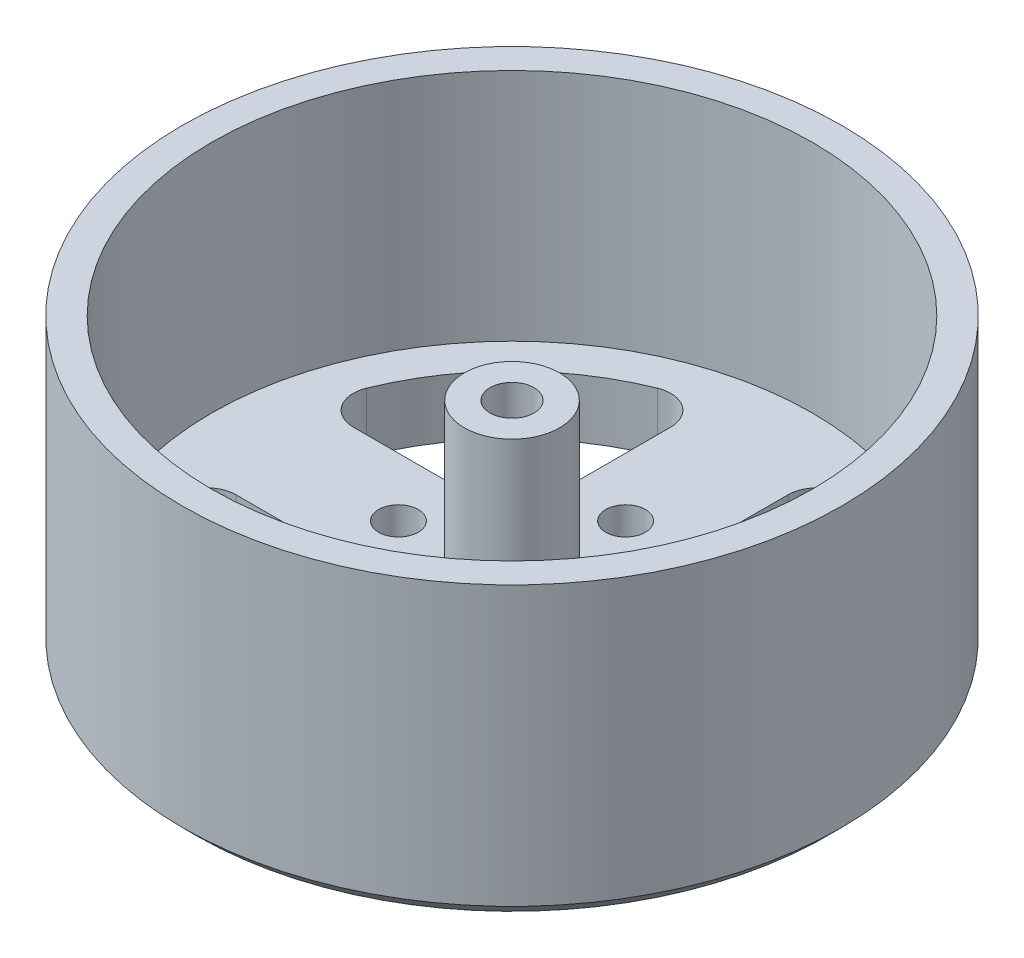
ISO-10303-21;
HEADER;
FILE_DESCRIPTION(('STEP AP214'),'2;1');
FILE_NAME('part.step','',(''),(''),'','','');
FILE_SCHEMA(('AUTOMOTIVE_DESIGN { 1 0 10303 214 1 1 1 1 }'));
ENDSEC;
DATA;
#1=APPLICATION_CONTEXT('core data for automotive mechanical design processes');
#2=APPLICATION_PROTOCOL_DEFINITION('international standard','automotive_design',2000,#1);
#3=PRODUCT_CONTEXT('',#1,'mechanical');
#4=PRODUCT('Part','Part','',(#3));
#5=PRODUCT_RELATED_PRODUCT_CATEGORY('part','',(#4));
#6=PRODUCT_DEFINITION_FORMATION('','',#4);
#7=PRODUCT_DEFINITION_CONTEXT('part definition',#1,'design');
#8=PRODUCT_DEFINITION('design','',#6,#7);
#9=PRODUCT_DEFINITION_SHAPE('','',#8);
#10=(LENGTH_UNIT() NAMED_UNIT(*) SI_UNIT(.MILLI.,.METRE.));
#11=(NAMED_UNIT(*) PLANE_ANGLE_UNIT() SI_UNIT($,.RADIAN.));
#12=(NAMED_UNIT(*) SI_UNIT($,.STERADIAN.) SOLID_ANGLE_UNIT());
#13=UNCERTAINTY_MEASURE_WITH_UNIT(LENGTH_MEASURE(1.E-05),#10,'distance_accuracy_value','');
#14=(GEOMETRIC_REPRESENTATION_CONTEXT(3) GLOBAL_UNCERTAINTY_ASSIGNED_CONTEXT((#13)) GLOBAL_UNIT_ASSIGNED_CONTEXT((#10,
#11,#12)) REPRESENTATION_CONTEXT('',''));
#15=CARTESIAN_POINT('',(0.,0.,0.));
#16=DIRECTION('',(0.,0.,1.));
#17=DIRECTION('',(1.,0.,0.));
#18=AXIS2_PLACEMENT_3D('',#15,#16,#17);
#19=CARTESIAN_POINT('',(0.,4.,0.));
#20=DIRECTION('',(0.,-1.,0.));
#21=DIRECTION('',(0.,0.,-1.));
#22=AXIS2_PLACEMENT_3D('',#19,#20,#21);
#23=CYLINDRICAL_SURFACE('',#22,18.);
#24=CARTESIAN_POINT('',(0.,0.,0.));
#25=DIRECTION('',(0.,1.,0.));
#26=DIRECTION('',(0.,0.,1.));
#27=AXIS2_PLACEMENT_3D('',#24,#25,#26);
#28=CIRCLE('',#27,18.);
#29=CARTESIAN_POINT('',(-6.75,0.,-16.6864465959652));
#30=VERTEX_POINT('',#29);
#31=CARTESIAN_POINT('',(-16.6864465959652,0.,-6.75));
#32=VERTEX_POINT('',#31);
#33=EDGE_CURVE('E494',#30,#32,#28,.T.);
#34=ORIENTED_EDGE('',*,*,#33,.F.);
#35=DIRECTION('',(0.,-1.,0.));
#36=VECTOR('',#35,1.);
#37=CARTESIAN_POINT('',(-6.75,4.,-16.6864465959652));
#38=LINE('',#37,#36);
#39=CARTESIAN_POINT('',(-6.75,4.,-16.6864465959652));
#40=VERTEX_POINT('',#39);
#41=EDGE_CURVE('E303',#30,#40,#38,.F.);
#42=ORIENTED_EDGE('',*,*,#41,.T.);
#43=CARTESIAN_POINT('',(0.,4.,0.));
#44=DIRECTION('',(0.,1.,0.));
#45=DIRECTION('',(0.,0.,1.));
#46=AXIS2_PLACEMENT_3D('',#43,#44,#45);
#47=CIRCLE('',#46,18.);
#48=CARTESIAN_POINT('',(-16.6864465959652,4.,-6.75));
#49=VERTEX_POINT('',#48);
#50=EDGE_CURVE('E453',#40,#49,#47,.T.);
#51=ORIENTED_EDGE('',*,*,#50,.T.);
#52=DIRECTION('',(0.,-1.,0.));
#53=VECTOR('',#52,1.);
#54=CARTESIAN_POINT('',(-16.6864465959652,4.,-6.75));
#55=LINE('',#54,#53);
#56=EDGE_CURVE('E300',#49,#32,#55,.T.);
#57=ORIENTED_EDGE('',*,*,#56,.T.);
#58=EDGE_LOOP('',(#34,#42,#51,#57));
#59=FACE_BOUND('',#58,.T.);
#60=ADVANCED_FACE('F38',(#59),#23,.F.);
#61=CARTESIAN_POINT('',(-4.,4.,0.));
#62=DIRECTION('',(-1.,0.,0.));
#63=DIRECTION('',(0.,0.,1.));
#64=AXIS2_PLACEMENT_3D('',#61,#62,#63);
#65=PLANE('',#64);
#66=DIRECTION('',(0.,0.,-1.));
#67=VECTOR('',#66,1.);
#68=CARTESIAN_POINT('',(-4.,4.,0.));
#69=LINE('',#68,#67);
#70=CARTESIAN_POINT('',(-4.,4.,-9.));
#71=VERTEX_POINT('',#70);
#72=CARTESIAN_POINT('',(-4.,4.,-14.8323969741913));
#73=VERTEX_POINT('',#72);
#74=EDGE_CURVE('E450',#71,#73,#69,.T.);
#75=ORIENTED_EDGE('',*,*,#74,.T.);
#76=DIRECTION('',(0.,1.,0.));
#77=VECTOR('',#76,1.);
#78=CARTESIAN_POINT('',(-4.,0.,-14.8323969741913));
#79=LINE('',#78,#77);
#80=CARTESIAN_POINT('',(-4.,0.,-14.8323969741913));
#81=VERTEX_POINT('',#80);
#82=EDGE_CURVE('E297',#73,#81,#79,.F.);
#83=ORIENTED_EDGE('',*,*,#82,.T.);
#84=DIRECTION('',(0.,0.,-1.));
#85=VECTOR('',#84,1.);
#86=CARTESIAN_POINT('',(-4.,0.,0.));
#87=LINE('',#86,#85);
#88=CARTESIAN_POINT('',(-4.,0.,-9.));
#89=VERTEX_POINT('',#88);
#90=EDGE_CURVE('E496',#89,#81,#87,.T.);
#91=ORIENTED_EDGE('',*,*,#90,.F.);
#92=DIRECTION('',(0.,-1.,0.));
#93=VECTOR('',#92,1.);
#94=CARTESIAN_POINT('',(-4.,4.,-9.));
#95=LINE('',#94,#93);
#96=EDGE_CURVE('E221',#89,#71,#95,.F.);
#97=ORIENTED_EDGE('',*,*,#96,.T.);
#98=EDGE_LOOP('',(#75,#83,#91,#97));
#99=FACE_BOUND('',#98,.T.);
#100=ADVANCED_FACE('F351',(#99),#65,.T.);
#101=CARTESIAN_POINT('',(0.,4.,0.));
#102=DIRECTION('',(0.,-1.,0.));
#103=DIRECTION('',(0.,0.,-1.));
#104=AXIS2_PLACEMENT_3D('',#101,#102,#103);
#105=CYLINDRICAL_SURFACE('',#104,18.);
#106=CARTESIAN_POINT('',(0.,0.,0.));
#107=DIRECTION('',(0.,1.,0.));
#108=DIRECTION('',(0.,0.,1.));
#109=AXIS2_PLACEMENT_3D('',#106,#107,#108);
#110=CIRCLE('',#109,18.);
#111=CARTESIAN_POINT('',(16.6864465959652,0.,-6.75));
#112=VERTEX_POINT('',#111);
#113=CARTESIAN_POINT('',(6.75,0.,-16.6864465959652));
#114=VERTEX_POINT('',#113);
#115=EDGE_CURVE('E210',#112,#114,#110,.T.);
#116=ORIENTED_EDGE('',*,*,#115,.F.);
#117=DIRECTION('',(0.,-1.,0.));
#118=VECTOR('',#117,1.);
#119=CARTESIAN_POINT('',(16.6864465959652,4.,-6.75));
#120=LINE('',#119,#118);
#121=CARTESIAN_POINT('',(16.6864465959652,4.,-6.75));
#122=VERTEX_POINT('',#121);
#123=EDGE_CURVE('E283',#112,#122,#120,.F.);
#124=ORIENTED_EDGE('',*,*,#123,.T.);
#125=CARTESIAN_POINT('',(0.,4.,0.));
#126=DIRECTION('',(0.,1.,0.));
#127=DIRECTION('',(0.,0.,1.));
#128=AXIS2_PLACEMENT_3D('',#125,#126,#127);
#129=CIRCLE('',#128,18.);
#130=CARTESIAN_POINT('',(6.75,4.,-16.6864465959652));
#131=VERTEX_POINT('',#130);
#132=EDGE_CURVE('E533',#122,#131,#129,.T.);
#133=ORIENTED_EDGE('',*,*,#132,.T.);
#134=DIRECTION('',(0.,-1.,0.));
#135=VECTOR('',#134,1.);
#136=CARTESIAN_POINT('',(6.75,4.,-16.6864465959652));
#137=LINE('',#136,#135);
#138=EDGE_CURVE('E280',#131,#114,#137,.T.);
#139=ORIENTED_EDGE('',*,*,#138,.T.);
#140=EDGE_LOOP('',(#116,#124,#133,#139));
#141=FACE_BOUND('',#140,.T.);
#142=ADVANCED_FACE('F357',(#141),#105,.F.);
#143=CARTESIAN_POINT('',(0.,4.,-4.));
#144=DIRECTION('',(0.,0.,-1.));
#145=DIRECTION('',(-1.,0.,0.));
#146=AXIS2_PLACEMENT_3D('',#143,#144,#145);
#147=PLANE('',#146);
#148=DIRECTION('',(1.,0.,0.));
#149=VECTOR('',#148,1.);
#150=CARTESIAN_POINT('',(0.,4.,-4.));
#151=LINE('',#150,#149);
#152=CARTESIAN_POINT('',(9.,4.,-4.));
#153=VERTEX_POINT('',#152);
#154=CARTESIAN_POINT('',(14.8323969741913,4.,-4.));
#155=VERTEX_POINT('',#154);
#156=EDGE_CURVE('E536',#153,#155,#151,.T.);
#157=ORIENTED_EDGE('',*,*,#156,.T.);
#158=DIRECTION('',(0.,1.,0.));
#159=VECTOR('',#158,1.);
#160=CARTESIAN_POINT('',(14.8323969741913,0.,-4.));
#161=LINE('',#160,#159);
#162=CARTESIAN_POINT('',(14.8323969741913,0.,-4.));
#163=VERTEX_POINT('',#162);
#164=EDGE_CURVE('E277',#155,#163,#161,.F.);
#165=ORIENTED_EDGE('',*,*,#164,.T.);
#166=DIRECTION('',(1.,0.,0.));
#167=VECTOR('',#166,1.);
#168=CARTESIAN_POINT('',(0.,0.,-4.));
#169=LINE('',#168,#167);
#170=CARTESIAN_POINT('',(9.,0.,-4.));
#171=VERTEX_POINT('',#170);
#172=EDGE_CURVE('E489',#171,#163,#169,.T.);
#173=ORIENTED_EDGE('',*,*,#172,.F.);
#174=DIRECTION('',(0.,-1.,0.));
#175=VECTOR('',#174,1.);
#176=CARTESIAN_POINT('',(9.,4.,-4.));
#177=LINE('',#176,#175);
#178=EDGE_CURVE('E245',#171,#153,#177,.F.);
#179=ORIENTED_EDGE('',*,*,#178,.T.);
#180=EDGE_LOOP('',(#157,#165,#173,#179));
#181=FACE_BOUND('',#180,.T.);
#182=ADVANCED_FACE('F368',(#181),#147,.T.);
#183=CARTESIAN_POINT('',(0.,4.,0.));
#184=DIRECTION('',(0.,-1.,0.));
#185=DIRECTION('',(0.,0.,-1.));
#186=AXIS2_PLACEMENT_3D('',#183,#184,#185);
#187=CYLINDRICAL_SURFACE('',#186,18.);
#188=CARTESIAN_POINT('',(0.,4.,0.));
#189=DIRECTION('',(0.,1.,0.));
#190=DIRECTION('',(0.,0.,1.));
#191=AXIS2_PLACEMENT_3D('',#188,#189,#190);
#192=CIRCLE('',#191,18.);
#193=CARTESIAN_POINT('',(-16.6864465959652,4.,6.75));
#194=VERTEX_POINT('',#193);
#195=CARTESIAN_POINT('',(-6.75,4.,16.6864465959652));
#196=VERTEX_POINT('',#195);
#197=EDGE_CURVE('E526',#194,#196,#192,.T.);
#198=ORIENTED_EDGE('',*,*,#197,.T.);
#199=DIRECTION('',(0.,-1.,0.));
#200=VECTOR('',#199,1.);
#201=CARTESIAN_POINT('',(-6.75,4.,16.6864465959652));
#202=LINE('',#201,#200);
#203=CARTESIAN_POINT('',(-6.75,0.,16.6864465959652));
#204=VERTEX_POINT('',#203);
#205=EDGE_CURVE('E289',#196,#204,#202,.T.);
#206=ORIENTED_EDGE('',*,*,#205,.T.);
#207=CARTESIAN_POINT('',(0.,0.,0.));
#208=DIRECTION('',(0.,1.,0.));
#209=DIRECTION('',(0.,0.,1.));
#210=AXIS2_PLACEMENT_3D('',#207,#208,#209);
#211=CIRCLE('',#210,18.);
#212=CARTESIAN_POINT('',(-16.6864465959652,0.,6.75));
#213=VERTEX_POINT('',#212);
#214=EDGE_CURVE('E484',#213,#204,#211,.T.);
#215=ORIENTED_EDGE('',*,*,#214,.F.);
#216=DIRECTION('',(0.,-1.,0.));
#217=VECTOR('',#216,1.);
#218=CARTESIAN_POINT('',(-16.6864465959652,4.,6.75));
#219=LINE('',#218,#217);
#220=EDGE_CURVE('E287',#213,#194,#219,.F.);
#221=ORIENTED_EDGE('',*,*,#220,.T.);
#222=EDGE_LOOP('',(#198,#206,#215,#221));
#223=FACE_BOUND('',#222,.T.);
#224=ADVANCED_FACE('F371',(#223),#187,.F.);
#225=CARTESIAN_POINT('',(0.,4.,4.));
#226=DIRECTION('',(0.,0.,1.));
#227=DIRECTION('',(1.,0.,0.));
#228=AXIS2_PLACEMENT_3D('',#225,#226,#227);
#229=PLANE('',#228);
#230=DIRECTION('',(-1.,0.,0.));
#231=VECTOR('',#230,1.);
#232=CARTESIAN_POINT('',(0.,4.,4.));
#233=LINE('',#232,#231);
#234=CARTESIAN_POINT('',(-9.,4.,4.));
#235=VERTEX_POINT('',#234);
#236=CARTESIAN_POINT('',(-14.8323969741913,4.,4.));
#237=VERTEX_POINT('',#236);
#238=EDGE_CURVE('E529',#235,#237,#233,.T.);
#239=ORIENTED_EDGE('',*,*,#238,.T.);
#240=DIRECTION('',(0.,1.,0.));
#241=VECTOR('',#240,1.);
#242=CARTESIAN_POINT('',(-14.8323969741913,0.,4.));
#243=LINE('',#242,#241);
#244=CARTESIAN_POINT('',(-14.8323969741913,0.,4.));
#245=VERTEX_POINT('',#244);
#246=EDGE_CURVE('E294',#237,#245,#243,.F.);
#247=ORIENTED_EDGE('',*,*,#246,.T.);
#248=DIRECTION('',(-1.,0.,0.));
#249=VECTOR('',#248,1.);
#250=CARTESIAN_POINT('',(0.,0.,4.));
#251=LINE('',#250,#249);
#252=CARTESIAN_POINT('',(-9.,0.,4.));
#253=VERTEX_POINT('',#252);
#254=EDGE_CURVE('E211',#253,#245,#251,.T.);
#255=ORIENTED_EDGE('',*,*,#254,.F.);
#256=DIRECTION('',(0.,-1.,0.));
#257=VECTOR('',#256,1.);
#258=CARTESIAN_POINT('',(-9.,4.,4.));
#259=LINE('',#258,#257);
#260=EDGE_CURVE('E219',#253,#235,#259,.F.);
#261=ORIENTED_EDGE('',*,*,#260,.T.);
#262=EDGE_LOOP('',(#239,#247,#255,#261));
#263=FACE_BOUND('',#262,.T.);
#264=ADVANCED_FACE('F379',(#263),#229,.T.);
#265=CARTESIAN_POINT('',(0.,4.,0.));
#266=DIRECTION('',(0.,-1.,0.));
#267=DIRECTION('',(0.,0.,-1.));
#268=AXIS2_PLACEMENT_3D('',#265,#266,#267);
#269=CYLINDRICAL_SURFACE('',#268,18.);
#270=CARTESIAN_POINT('',(0.,0.,0.));
#271=DIRECTION('',(0.,1.,0.));
#272=DIRECTION('',(0.,0.,1.));
#273=AXIS2_PLACEMENT_3D('',#270,#271,#272);
#274=CIRCLE('',#273,18.);
#275=CARTESIAN_POINT('',(6.75,0.,16.6864465959652));
#276=VERTEX_POINT('',#275);
#277=CARTESIAN_POINT('',(16.6864465959652,0.,6.75));
#278=VERTEX_POINT('',#277);
#279=EDGE_CURVE('E475',#276,#278,#274,.T.);
#280=ORIENTED_EDGE('',*,*,#279,.F.);
#281=DIRECTION('',(0.,-1.,0.));
#282=VECTOR('',#281,1.);
#283=CARTESIAN_POINT('',(6.75,4.,16.6864465959652));
#284=LINE('',#283,#282);
#285=CARTESIAN_POINT('',(6.75,4.,16.6864465959652));
#286=VERTEX_POINT('',#285);
#287=EDGE_CURVE('E273',#276,#286,#284,.F.);
#288=ORIENTED_EDGE('',*,*,#287,.T.);
#289=CARTESIAN_POINT('',(0.,4.,0.));
#290=DIRECTION('',(0.,1.,0.));
#291=DIRECTION('',(0.,0.,1.));
#292=AXIS2_PLACEMENT_3D('',#289,#290,#291);
#293=CIRCLE('',#292,18.);
#294=CARTESIAN_POINT('',(16.6864465959652,4.,6.75));
#295=VERTEX_POINT('',#294);
#296=EDGE_CURVE('E510',#286,#295,#293,.T.);
#297=ORIENTED_EDGE('',*,*,#296,.T.);
#298=DIRECTION('',(0.,-1.,0.));
#299=VECTOR('',#298,1.);
#300=CARTESIAN_POINT('',(16.6864465959652,4.,6.75));
#301=LINE('',#300,#299);
#302=EDGE_CURVE('E270',#295,#278,#301,.T.);
#303=ORIENTED_EDGE('',*,*,#302,.T.);
#304=EDGE_LOOP('',(#280,#288,#297,#303));
#305=FACE_BOUND('',#304,.T.);
#306=ADVANCED_FACE('F382',(#305),#269,.F.);
#307=CARTESIAN_POINT('',(4.,4.,0.));
#308=DIRECTION('',(1.,0.,0.));
#309=DIRECTION('',(0.,0.,-1.));
#310=AXIS2_PLACEMENT_3D('',#307,#308,#309);
#311=PLANE('',#310);
#312=DIRECTION('',(0.,0.,1.));
#313=VECTOR('',#312,1.);
#314=CARTESIAN_POINT('',(4.,4.,0.));
#315=LINE('',#314,#313);
#316=CARTESIAN_POINT('',(4.,4.,9.));
#317=VERTEX_POINT('',#316);
#318=CARTESIAN_POINT('',(4.,4.,14.8323969741913));
#319=VERTEX_POINT('',#318);
#320=EDGE_CURVE('E514',#317,#319,#315,.T.);
#321=ORIENTED_EDGE('',*,*,#320,.T.);
#322=DIRECTION('',(0.,1.,0.));
#323=VECTOR('',#322,1.);
#324=CARTESIAN_POINT('',(4.,0.,14.8323969741913));
#325=LINE('',#324,#323);
#326=CARTESIAN_POINT('',(4.,0.,14.8323969741913));
#327=VERTEX_POINT('',#326);
#328=EDGE_CURVE('E267',#319,#327,#325,.F.);
#329=ORIENTED_EDGE('',*,*,#328,.T.);
#330=DIRECTION('',(0.,0.,1.));
#331=VECTOR('',#330,1.);
#332=CARTESIAN_POINT('',(4.,0.,0.));
#333=LINE('',#332,#331);
#334=CARTESIAN_POINT('',(4.,0.,9.));
#335=VERTEX_POINT('',#334);
#336=EDGE_CURVE('E478',#335,#327,#333,.T.);
#337=ORIENTED_EDGE('',*,*,#336,.F.);
#338=DIRECTION('',(0.,-1.,0.));
#339=VECTOR('',#338,1.);
#340=CARTESIAN_POINT('',(4.,4.,9.));
#341=LINE('',#340,#339);
#342=EDGE_CURVE('E240',#335,#317,#341,.F.);
#343=ORIENTED_EDGE('',*,*,#342,.T.);
#344=EDGE_LOOP('',(#321,#329,#337,#343));
#345=FACE_BOUND('',#344,.T.);
#346=ADVANCED_FACE('F391',(#345),#311,.T.);
#347=CARTESIAN_POINT('',(-7.75,4.,0.));
#348=DIRECTION('',(0.,-1.,0.));
#349=DIRECTION('',(0.,0.,-1.));
#350=AXIS2_PLACEMENT_3D('',#347,#348,#349);
#351=CYLINDRICAL_SURFACE('',#350,1.35);
#352=CARTESIAN_POINT('',(-7.75,4.,0.));
#353=DIRECTION('',(0.,1.,0.));
#354=DIRECTION('',(0.,0.,1.));
#355=AXIS2_PLACEMENT_3D('',#352,#353,#354);
#356=CIRCLE('',#355,1.35);
#357=CARTESIAN_POINT('',(-7.75,4.,1.35));
#358=VERTEX_POINT('',#357);
#359=EDGE_CURVE('E232',#358,#358,#356,.T.);
#360=ORIENTED_EDGE('',*,*,#359,.T.);
#361=EDGE_LOOP('',(#360));
#362=FACE_BOUND('',#361,.T.);
#363=CARTESIAN_POINT('',(-7.75,0.,0.));
#364=DIRECTION('',(0.,1.,0.));
#365=DIRECTION('',(0.,0.,1.));
#366=AXIS2_PLACEMENT_3D('',#363,#364,#365);
#367=CIRCLE('',#366,1.35);
#368=CARTESIAN_POINT('',(-7.75,0.,1.35));
#369=VERTEX_POINT('',#368);
#370=EDGE_CURVE('E235',#369,#369,#367,.T.);
#371=ORIENTED_EDGE('',*,*,#370,.F.);
#372=EDGE_LOOP('',(#371));
#373=FACE_BOUND('',#372,.T.);
#374=ADVANCED_FACE('F394',(#362,#373),#351,.F.);
#375=CARTESIAN_POINT('',(0.,4.,-7.75));
#376=DIRECTION('',(0.,-1.,0.));
#377=DIRECTION('',(0.,0.,-1.));
#378=AXIS2_PLACEMENT_3D('',#375,#376,#377);
#379=CYLINDRICAL_SURFACE('',#378,1.35);
#380=CARTESIAN_POINT('',(0.,4.,-7.75));
#381=DIRECTION('',(0.,1.,0.));
#382=DIRECTION('',(0.,0.,1.));
#383=AXIS2_PLACEMENT_3D('',#380,#381,#382);
#384=CIRCLE('',#383,1.35);
#385=CARTESIAN_POINT('',(0.,4.,-6.4));
#386=VERTEX_POINT('',#385);
#387=EDGE_CURVE('E470',#386,#386,#384,.T.);
#388=ORIENTED_EDGE('',*,*,#387,.T.);
#389=EDGE_LOOP('',(#388));
#390=FACE_BOUND('',#389,.T.);
#391=CARTESIAN_POINT('',(0.,0.,-7.75));
#392=DIRECTION('',(0.,1.,0.));
#393=DIRECTION('',(0.,0.,1.));
#394=AXIS2_PLACEMENT_3D('',#391,#392,#393);
#395=CIRCLE('',#394,1.35);
#396=CARTESIAN_POINT('',(0.,0.,-6.4));
#397=VERTEX_POINT('',#396);
#398=EDGE_CURVE('E505',#397,#397,#395,.T.);
#399=ORIENTED_EDGE('',*,*,#398,.F.);
#400=EDGE_LOOP('',(#399));
#401=FACE_BOUND('',#400,.T.);
#402=ADVANCED_FACE('F605',(#390,#401),#379,.F.);
#403=CARTESIAN_POINT('',(7.75,4.,0.));
#404=DIRECTION('',(0.,-1.,0.));
#405=DIRECTION('',(0.,0.,-1.));
#406=AXIS2_PLACEMENT_3D('',#403,#404,#405);
#407=CYLINDRICAL_SURFACE('',#406,1.35);
#408=CARTESIAN_POINT('',(7.75,4.,0.));
#409=DIRECTION('',(0.,1.,0.));
#410=DIRECTION('',(0.,0.,1.));
#411=AXIS2_PLACEMENT_3D('',#408,#409,#410);
#412=CIRCLE('',#411,1.35);
#413=CARTESIAN_POINT('',(7.75,4.,1.35));
#414=VERTEX_POINT('',#413);
#415=EDGE_CURVE('E467',#414,#414,#412,.T.);
#416=ORIENTED_EDGE('',*,*,#415,.T.);
#417=EDGE_LOOP('',(#416));
#418=FACE_BOUND('',#417,.T.);
#419=CARTESIAN_POINT('',(7.75,0.,0.));
#420=DIRECTION('',(0.,1.,0.));
#421=DIRECTION('',(0.,0.,1.));
#422=AXIS2_PLACEMENT_3D('',#419,#420,#421);
#423=CIRCLE('',#422,1.35);
#424=CARTESIAN_POINT('',(7.75,0.,1.35));
#425=VERTEX_POINT('',#424);
#426=EDGE_CURVE('E503',#425,#425,#423,.T.);
#427=ORIENTED_EDGE('',*,*,#426,.F.);
#428=EDGE_LOOP('',(#427));
#429=FACE_BOUND('',#428,.T.);
#430=ADVANCED_FACE('F609',(#418,#429),#407,.F.);
#431=CARTESIAN_POINT('',(0.,4.,7.75));
#432=DIRECTION('',(0.,-1.,0.));
#433=DIRECTION('',(0.,0.,-1.));
#434=AXIS2_PLACEMENT_3D('',#431,#432,#433);
#435=CYLINDRICAL_SURFACE('',#434,1.35);
#436=CARTESIAN_POINT('',(0.,4.,7.75));
#437=DIRECTION('',(0.,1.,0.));
#438=DIRECTION('',(0.,0.,1.));
#439=AXIS2_PLACEMENT_3D('',#436,#437,#438);
#440=CIRCLE('',#439,1.35);
#441=CARTESIAN_POINT('',(0.,4.,9.1));
#442=VERTEX_POINT('',#441);
#443=EDGE_CURVE('E459',#442,#442,#440,.T.);
#444=ORIENTED_EDGE('',*,*,#443,.T.);
#445=EDGE_LOOP('',(#444));
#446=FACE_BOUND('',#445,.T.);
#447=CARTESIAN_POINT('',(0.,0.,7.75));
#448=DIRECTION('',(0.,1.,0.));
#449=DIRECTION('',(0.,0.,1.));
#450=AXIS2_PLACEMENT_3D('',#447,#448,#449);
#451=CIRCLE('',#450,1.35);
#452=CARTESIAN_POINT('',(0.,0.,9.1));
#453=VERTEX_POINT('',#452);
#454=EDGE_CURVE('E500',#453,#453,#451,.T.);
#455=ORIENTED_EDGE('',*,*,#454,.F.);
#456=EDGE_LOOP('',(#455));
#457=FACE_BOUND('',#456,.T.);
#458=ADVANCED_FACE('F613',(#446,#457),#435,.F.);
#459=CARTESIAN_POINT('',(0.,4.,-4.));
#460=DIRECTION('',(0.,0.,-1.));
#461=DIRECTION('',(-1.,0.,0.));
#462=AXIS2_PLACEMENT_3D('',#459,#460,#461);
#463=PLANE('',#462);
#464=DIRECTION('',(1.,0.,0.));
#465=VECTOR('',#464,1.);
#466=CARTESIAN_POINT('',(0.,0.,-4.));
#467=LINE('',#466,#465);
#468=CARTESIAN_POINT('',(-14.8323969741913,0.,-4.));
#469=VERTEX_POINT('',#468);
#470=CARTESIAN_POINT('',(-9.,0.,-4.));
#471=VERTEX_POINT('',#470);
#472=EDGE_CURVE('E498',#469,#471,#467,.T.);
#473=ORIENTED_EDGE('',*,*,#472,.F.);
#474=DIRECTION('',(0.,1.,0.));
#475=VECTOR('',#474,1.);
#476=CARTESIAN_POINT('',(-14.8323969741913,4.,-4.));
#477=LINE('',#476,#475);
#478=CARTESIAN_POINT('',(-14.8323969741913,4.,-4.));
#479=VERTEX_POINT('',#478);
#480=EDGE_CURVE('E60',#469,#479,#477,.T.);
#481=ORIENTED_EDGE('',*,*,#480,.T.);
#482=DIRECTION('',(1.,0.,0.));
#483=VECTOR('',#482,1.);
#484=CARTESIAN_POINT('',(0.,4.,-4.));
#485=LINE('',#484,#483);
#486=CARTESIAN_POINT('',(-9.,4.,-4.));
#487=VERTEX_POINT('',#486);
#488=EDGE_CURVE('E457',#479,#487,#485,.T.);
#489=ORIENTED_EDGE('',*,*,#488,.T.);
#490=DIRECTION('',(0.,-1.,0.));
#491=VECTOR('',#490,1.);
#492=CARTESIAN_POINT('',(-9.,0.,-4.));
#493=LINE('',#492,#491);
#494=EDGE_CURVE('E247',#487,#471,#493,.T.);
#495=ORIENTED_EDGE('',*,*,#494,.T.);
#496=EDGE_LOOP('',(#473,#481,#489,#495));
#497=FACE_BOUND('',#496,.T.);
#498=ADVANCED_FACE('F366',(#497),#463,.T.);
#499=CARTESIAN_POINT('',(4.,4.,0.));
#500=DIRECTION('',(1.,0.,0.));
#501=DIRECTION('',(0.,0.,-1.));
#502=AXIS2_PLACEMENT_3D('',#499,#500,#501);
#503=PLANE('',#502);
#504=DIRECTION('',(0.,0.,1.));
#505=VECTOR('',#504,1.);
#506=CARTESIAN_POINT('',(4.,0.,0.));
#507=LINE('',#506,#505);
#508=CARTESIAN_POINT('',(4.,0.,-14.8323969741913));
#509=VERTEX_POINT('',#508);
#510=CARTESIAN_POINT('',(4.,0.,-9.));
#511=VERTEX_POINT('',#510);
#512=EDGE_CURVE('E492',#509,#511,#507,.T.);
#513=ORIENTED_EDGE('',*,*,#512,.F.);
#514=DIRECTION('',(0.,1.,0.));
#515=VECTOR('',#514,1.);
#516=CARTESIAN_POINT('',(4.,4.,-14.8323969741913));
#517=LINE('',#516,#515);
#518=CARTESIAN_POINT('',(4.,4.,-14.8323969741913));
#519=VERTEX_POINT('',#518);
#520=EDGE_CURVE('E285',#509,#519,#517,.T.);
#521=ORIENTED_EDGE('',*,*,#520,.T.);
#522=DIRECTION('',(0.,0.,1.));
#523=VECTOR('',#522,1.);
#524=CARTESIAN_POINT('',(4.,4.,0.));
#525=LINE('',#524,#523);
#526=CARTESIAN_POINT('',(4.,4.,-9.));
#527=VERTEX_POINT('',#526);
#528=EDGE_CURVE('E461',#519,#527,#525,.T.);
#529=ORIENTED_EDGE('',*,*,#528,.T.);
#530=DIRECTION('',(0.,-1.,0.));
#531=VECTOR('',#530,1.);
#532=CARTESIAN_POINT('',(4.,0.,-9.));
#533=LINE('',#532,#531);
#534=EDGE_CURVE('E242',#527,#511,#533,.T.);
#535=ORIENTED_EDGE('',*,*,#534,.T.);
#536=EDGE_LOOP('',(#513,#521,#529,#535));
#537=FACE_BOUND('',#536,.T.);
#538=ADVANCED_FACE('F363',(#537),#503,.T.);
#539=CARTESIAN_POINT('',(-4.,4.,0.));
#540=DIRECTION('',(-1.,0.,0.));
#541=DIRECTION('',(0.,0.,1.));
#542=AXIS2_PLACEMENT_3D('',#539,#540,#541);
#543=PLANE('',#542);
#544=DIRECTION('',(0.,0.,-1.));
#545=VECTOR('',#544,1.);
#546=CARTESIAN_POINT('',(-4.,0.,0.));
#547=LINE('',#546,#545);
#548=CARTESIAN_POINT('',(-4.,0.,14.8323969741913));
#549=VERTEX_POINT('',#548);
#550=CARTESIAN_POINT('',(-4.,0.,9.));
#551=VERTEX_POINT('',#550);
#552=EDGE_CURVE('E198',#549,#551,#547,.T.);
#553=ORIENTED_EDGE('',*,*,#552,.F.);
#554=DIRECTION('',(0.,1.,0.));
#555=VECTOR('',#554,1.);
#556=CARTESIAN_POINT('',(-4.,4.,14.8323969741913));
#557=LINE('',#556,#555);
#558=CARTESIAN_POINT('',(-4.,4.,14.8323969741913));
#559=VERTEX_POINT('',#558);
#560=EDGE_CURVE('E292',#549,#559,#557,.T.);
#561=ORIENTED_EDGE('',*,*,#560,.T.);
#562=DIRECTION('',(0.,0.,-1.));
#563=VECTOR('',#562,1.);
#564=CARTESIAN_POINT('',(-4.,4.,0.));
#565=LINE('',#564,#563);
#566=CARTESIAN_POINT('',(-4.,4.,9.));
#567=VERTEX_POINT('',#566);
#568=EDGE_CURVE('E225',#559,#567,#565,.T.);
#569=ORIENTED_EDGE('',*,*,#568,.T.);
#570=DIRECTION('',(0.,-1.,0.));
#571=VECTOR('',#570,1.);
#572=CARTESIAN_POINT('',(-4.,0.,9.));
#573=LINE('',#572,#571);
#574=EDGE_CURVE('E218',#567,#551,#573,.T.);
#575=ORIENTED_EDGE('',*,*,#574,.T.);
#576=EDGE_LOOP('',(#553,#561,#569,#575));
#577=FACE_BOUND('',#576,.T.);
#578=ADVANCED_FACE('F223',(#577),#543,.T.);
#579=CARTESIAN_POINT('',(0.,4.,4.));
#580=DIRECTION('',(0.,0.,1.));
#581=DIRECTION('',(1.,0.,0.));
#582=AXIS2_PLACEMENT_3D('',#579,#580,#581);
#583=PLANE('',#582);
#584=DIRECTION('',(-1.,0.,0.));
#585=VECTOR('',#584,1.);
#586=CARTESIAN_POINT('',(0.,0.,4.));
#587=LINE('',#586,#585);
#588=CARTESIAN_POINT('',(14.8323969741913,0.,4.));
#589=VERTEX_POINT('',#588);
#590=CARTESIAN_POINT('',(9.,0.,4.));
#591=VERTEX_POINT('',#590);
#592=EDGE_CURVE('E482',#589,#591,#587,.T.);
#593=ORIENTED_EDGE('',*,*,#592,.F.);
#594=DIRECTION('',(0.,1.,0.));
#595=VECTOR('',#594,1.);
#596=CARTESIAN_POINT('',(14.8323969741913,4.,4.));
#597=LINE('',#596,#595);
#598=CARTESIAN_POINT('',(14.8323969741913,4.,4.));
#599=VERTEX_POINT('',#598);
#600=EDGE_CURVE('E275',#589,#599,#597,.T.);
#601=ORIENTED_EDGE('',*,*,#600,.T.);
#602=DIRECTION('',(-1.,0.,0.));
#603=VECTOR('',#602,1.);
#604=CARTESIAN_POINT('',(0.,4.,4.));
#605=LINE('',#604,#603);
#606=CARTESIAN_POINT('',(9.,4.,4.));
#607=VERTEX_POINT('',#606);
#608=EDGE_CURVE('E519',#599,#607,#605,.T.);
#609=ORIENTED_EDGE('',*,*,#608,.T.);
#610=DIRECTION('',(0.,-1.,0.));
#611=VECTOR('',#610,1.);
#612=CARTESIAN_POINT('',(9.,0.,4.));
#613=LINE('',#612,#611);
#614=EDGE_CURVE('E229',#607,#591,#613,.T.);
#615=ORIENTED_EDGE('',*,*,#614,.T.);
#616=EDGE_LOOP('',(#593,#601,#609,#615));
#617=FACE_BOUND('',#616,.T.);
#618=ADVANCED_FACE('F378',(#617),#583,.T.);
#619=CARTESIAN_POINT('',(0.,4.,0.));
#620=DIRECTION('',(0.,1.,0.));
#621=DIRECTION('',(0.,0.,1.));
#622=AXIS2_PLACEMENT_3D('',#619,#620,#621);
#623=PLANE('',#622);
#624=ORIENTED_EDGE('',*,*,#296,.F.);
#625=CARTESIAN_POINT('',(6.,4.,14.8323969741913));
#626=DIRECTION('',(0.,1.,0.));
#627=DIRECTION('',(0.,0.,1.));
#628=AXIS2_PLACEMENT_3D('',#625,#626,#627);
#629=CIRCLE('',#628,2.);
#630=EDGE_CURVE('E308',#286,#319,#629,.F.);
#631=ORIENTED_EDGE('',*,*,#630,.T.);
#632=ORIENTED_EDGE('',*,*,#320,.F.);
#633=CARTESIAN_POINT('',(9.,4.,9.));
#634=DIRECTION('',(0.,1.,0.));
#635=DIRECTION('',(0.,0.,1.));
#636=AXIS2_PLACEMENT_3D('',#633,#634,#635);
#637=CIRCLE('',#636,5.);
#638=EDGE_CURVE('E254',#317,#607,#637,.F.);
#639=ORIENTED_EDGE('',*,*,#638,.T.);
#640=ORIENTED_EDGE('',*,*,#608,.F.);
#641=CARTESIAN_POINT('',(14.8323969741913,4.,6.));
#642=DIRECTION('',(0.,1.,0.));
#643=DIRECTION('',(0.,0.,1.));
#644=AXIS2_PLACEMENT_3D('',#641,#642,#643);
#645=CIRCLE('',#644,2.);
#646=EDGE_CURVE('E312',#599,#295,#645,.F.);
#647=ORIENTED_EDGE('',*,*,#646,.T.);
#648=EDGE_LOOP('',(#624,#631,#632,#639,#640,#647));
#649=FACE_BOUND('',#648,.T.);
#650=ORIENTED_EDGE('',*,*,#197,.F.);
#651=CARTESIAN_POINT('',(-14.8323969741913,4.,6.));
#652=DIRECTION('',(0.,1.,0.));
#653=DIRECTION('',(0.,0.,1.));
#654=AXIS2_PLACEMENT_3D('',#651,#652,#653);
#655=CIRCLE('',#654,2.);
#656=EDGE_CURVE('E327',#194,#237,#655,.F.);
#657=ORIENTED_EDGE('',*,*,#656,.T.);
#658=ORIENTED_EDGE('',*,*,#238,.F.);
#659=CARTESIAN_POINT('',(-9.,4.,9.));
#660=DIRECTION('',(0.,1.,0.));
#661=DIRECTION('',(0.,0.,1.));
#662=AXIS2_PLACEMENT_3D('',#659,#660,#661);
#663=CIRCLE('',#662,5.);
#664=EDGE_CURVE('E220',#235,#567,#663,.F.);
#665=ORIENTED_EDGE('',*,*,#664,.T.);
#666=ORIENTED_EDGE('',*,*,#568,.F.);
#667=CARTESIAN_POINT('',(-6.,4.,14.8323969741913));
#668=DIRECTION('',(0.,1.,0.));
#669=DIRECTION('',(0.,0.,1.));
#670=AXIS2_PLACEMENT_3D('',#667,#668,#669);
#671=CIRCLE('',#670,2.);
#672=EDGE_CURVE('E323',#559,#196,#671,.F.);
#673=ORIENTED_EDGE('',*,*,#672,.T.);
#674=EDGE_LOOP('',(#650,#657,#658,#665,#666,#673));
#675=FACE_BOUND('',#674,.T.);
#676=ORIENTED_EDGE('',*,*,#132,.F.);
#677=CARTESIAN_POINT('',(14.8323969741913,4.,-6.));
#678=DIRECTION('',(0.,1.,0.));
#679=DIRECTION('',(0.,0.,1.));
#680=AXIS2_PLACEMENT_3D('',#677,#678,#679);
#681=CIRCLE('',#680,2.);
#682=EDGE_CURVE('E316',#122,#155,#681,.F.);
#683=ORIENTED_EDGE('',*,*,#682,.T.);
#684=ORIENTED_EDGE('',*,*,#156,.F.);
#685=CARTESIAN_POINT('',(9.,4.,-9.));
#686=DIRECTION('',(0.,1.,0.));
#687=DIRECTION('',(0.,0.,1.));
#688=AXIS2_PLACEMENT_3D('',#685,#686,#687);
#689=CIRCLE('',#688,5.);
#690=EDGE_CURVE('E259',#153,#527,#689,.F.);
#691=ORIENTED_EDGE('',*,*,#690,.T.);
#692=ORIENTED_EDGE('',*,*,#528,.F.);
#693=CARTESIAN_POINT('',(6.,4.,-14.8323969741913));
#694=DIRECTION('',(0.,1.,0.));
#695=DIRECTION('',(0.,0.,1.));
#696=AXIS2_PLACEMENT_3D('',#693,#694,#695);
#697=CIRCLE('',#696,2.);
#698=EDGE_CURVE('E320',#519,#131,#697,.F.);
#699=ORIENTED_EDGE('',*,*,#698,.T.);
#700=EDGE_LOOP('',(#676,#683,#684,#691,#692,#699));
#701=FACE_BOUND('',#700,.T.);
#702=ORIENTED_EDGE('',*,*,#50,.F.);
#703=CARTESIAN_POINT('',(-6.,4.,-14.8323969741913));
#704=DIRECTION('',(0.,1.,0.));
#705=DIRECTION('',(0.,0.,1.));
#706=AXIS2_PLACEMENT_3D('',#703,#704,#705);
#707=CIRCLE('',#706,2.);
#708=EDGE_CURVE('E331',#40,#73,#707,.F.);
#709=ORIENTED_EDGE('',*,*,#708,.T.);
#710=ORIENTED_EDGE('',*,*,#74,.F.);
#711=CARTESIAN_POINT('',(-9.,4.,-9.));
#712=DIRECTION('',(0.,1.,0.));
#713=DIRECTION('',(0.,0.,1.));
#714=AXIS2_PLACEMENT_3D('',#711,#712,#713);
#715=CIRCLE('',#714,5.);
#716=EDGE_CURVE('E264',#71,#487,#715,.F.);
#717=ORIENTED_EDGE('',*,*,#716,.T.);
#718=ORIENTED_EDGE('',*,*,#488,.F.);
#719=CARTESIAN_POINT('',(-14.8323969741913,4.,-6.));
#720=DIRECTION('',(0.,1.,0.));
#721=DIRECTION('',(0.,0.,1.));
#722=AXIS2_PLACEMENT_3D('',#719,#720,#721);
#723=CIRCLE('',#722,2.);
#724=EDGE_CURVE('E334',#479,#49,#723,.F.);
#725=ORIENTED_EDGE('',*,*,#724,.T.);
#726=EDGE_LOOP('',(#702,#709,#710,#717,#718,#725));
#727=FACE_BOUND('',#726,.T.);
#728=ORIENTED_EDGE('',*,*,#443,.F.);
#729=EDGE_LOOP('',(#728));
#730=FACE_BOUND('',#729,.T.);
#731=ORIENTED_EDGE('',*,*,#415,.F.);
#732=EDGE_LOOP('',(#731));
#733=FACE_BOUND('',#732,.T.);
#734=ORIENTED_EDGE('',*,*,#387,.F.);
#735=EDGE_LOOP('',(#734));
#736=FACE_BOUND('',#735,.T.);
#737=ORIENTED_EDGE('',*,*,#359,.F.);
#738=EDGE_LOOP('',(#737));
#739=FACE_BOUND('',#738,.T.);
#740=CARTESIAN_POINT('',(0.,4.,0.));
#741=DIRECTION('',(0.,1.,0.));
#742=DIRECTION('',(0.,0.,1.));
#743=AXIS2_PLACEMENT_3D('',#740,#741,#742);
#744=CIRCLE('',#743,3.25);
#745=CARTESIAN_POINT('',(0.,4.,3.25));
#746=VERTEX_POINT('',#745);
#747=EDGE_CURVE('E227',#746,#746,#744,.T.);
#748=ORIENTED_EDGE('',*,*,#747,.F.);
#749=EDGE_LOOP('',(#748));
#750=FACE_BOUND('',#749,.T.);
#751=CARTESIAN_POINT('',(0.,4.,0.));
#752=DIRECTION('',(0.,1.,0.));
#753=DIRECTION('',(0.,0.,1.));
#754=AXIS2_PLACEMENT_3D('',#751,#752,#753);
#755=CIRCLE('',#754,20.5);
#756=CARTESIAN_POINT('',(0.,4.,20.5));
#757=VERTEX_POINT('',#756);
#758=EDGE_CURVE('E568',#757,#757,#755,.F.);
#759=ORIENTED_EDGE('',*,*,#758,.F.);
#760=EDGE_LOOP('',(#759));
#761=FACE_BOUND('',#760,.T.);
#762=ADVANCED_FACE('F389',(#649,#675,#701,#727,#730,#733,#736,#739,#750,#761),#623,.T.);
#763=CARTESIAN_POINT('',(0.,0.,0.));
#764=DIRECTION('',(0.,1.,0.));
#765=DIRECTION('',(0.,0.,1.));
#766=AXIS2_PLACEMENT_3D('',#763,#764,#765);
#767=PLANE('',#766);
#768=CARTESIAN_POINT('',(0.,0.,0.));
#769=DIRECTION('',(0.,1.,0.));
#770=DIRECTION('',(0.,0.,1.));
#771=AXIS2_PLACEMENT_3D('',#768,#769,#770);
#772=CIRCLE('',#771,21.5);
#773=CARTESIAN_POINT('',(0.,0.,21.5));
#774=VERTEX_POINT('',#773);
#775=EDGE_CURVE('E11',#774,#774,#772,.F.);
#776=ORIENTED_EDGE('',*,*,#775,.T.);
#777=EDGE_LOOP('',(#776));
#778=FACE_BOUND('',#777,.T.);
#779=ORIENTED_EDGE('',*,*,#336,.T.);
#780=CARTESIAN_POINT('',(6.,0.,14.8323969741913));
#781=DIRECTION('',(0.,1.,0.));
#782=DIRECTION('',(0.,0.,1.));
#783=AXIS2_PLACEMENT_3D('',#780,#781,#782);
#784=CIRCLE('',#783,2.);
#785=EDGE_CURVE('E306',#327,#276,#784,.T.);
#786=ORIENTED_EDGE('',*,*,#785,.T.);
#787=ORIENTED_EDGE('',*,*,#279,.T.);
#788=CARTESIAN_POINT('',(14.8323969741913,0.,6.));
#789=DIRECTION('',(0.,1.,0.));
#790=DIRECTION('',(0.,0.,1.));
#791=AXIS2_PLACEMENT_3D('',#788,#789,#790);
#792=CIRCLE('',#791,2.);
#793=EDGE_CURVE('E310',#278,#589,#792,.T.);
#794=ORIENTED_EDGE('',*,*,#793,.T.);
#795=ORIENTED_EDGE('',*,*,#592,.T.);
#796=CARTESIAN_POINT('',(9.,0.,9.));
#797=DIRECTION('',(0.,1.,0.));
#798=DIRECTION('',(0.,0.,1.));
#799=AXIS2_PLACEMENT_3D('',#796,#797,#798);
#800=CIRCLE('',#799,5.);
#801=EDGE_CURVE('E252',#591,#335,#800,.T.);
#802=ORIENTED_EDGE('',*,*,#801,.T.);
#803=EDGE_LOOP('',(#779,#786,#787,#794,#795,#802));
#804=FACE_BOUND('',#803,.T.);
#805=ORIENTED_EDGE('',*,*,#254,.T.);
#806=CARTESIAN_POINT('',(-14.8323969741913,0.,6.));
#807=DIRECTION('',(0.,1.,0.));
#808=DIRECTION('',(0.,0.,1.));
#809=AXIS2_PLACEMENT_3D('',#806,#807,#808);
#810=CIRCLE('',#809,2.);
#811=EDGE_CURVE('E325',#245,#213,#810,.T.);
#812=ORIENTED_EDGE('',*,*,#811,.T.);
#813=ORIENTED_EDGE('',*,*,#214,.T.);
#814=CARTESIAN_POINT('',(-6.,0.,14.8323969741913));
#815=DIRECTION('',(0.,1.,0.));
#816=DIRECTION('',(0.,0.,1.));
#817=AXIS2_PLACEMENT_3D('',#814,#815,#816);
#818=CIRCLE('',#817,2.);
#819=EDGE_CURVE('E206',#204,#549,#818,.T.);
#820=ORIENTED_EDGE('',*,*,#819,.T.);
#821=ORIENTED_EDGE('',*,*,#552,.T.);
#822=CARTESIAN_POINT('',(-9.,0.,9.));
#823=DIRECTION('',(0.,1.,0.));
#824=DIRECTION('',(0.,0.,1.));
#825=AXIS2_PLACEMENT_3D('',#822,#823,#824);
#826=CIRCLE('',#825,5.);
#827=EDGE_CURVE('E203',#551,#253,#826,.T.);
#828=ORIENTED_EDGE('',*,*,#827,.T.);
#829=EDGE_LOOP('',(#805,#812,#813,#820,#821,#828));
#830=FACE_BOUND('',#829,.T.);
#831=ORIENTED_EDGE('',*,*,#172,.T.);
#832=CARTESIAN_POINT('',(14.8323969741913,0.,-6.));
#833=DIRECTION('',(0.,1.,0.));
#834=DIRECTION('',(0.,0.,1.));
#835=AXIS2_PLACEMENT_3D('',#832,#833,#834);
#836=CIRCLE('',#835,2.);
#837=EDGE_CURVE('E314',#163,#112,#836,.T.);
#838=ORIENTED_EDGE('',*,*,#837,.T.);
#839=ORIENTED_EDGE('',*,*,#115,.T.);
#840=CARTESIAN_POINT('',(6.,0.,-14.8323969741913));
#841=DIRECTION('',(0.,1.,0.));
#842=DIRECTION('',(0.,0.,1.));
#843=AXIS2_PLACEMENT_3D('',#840,#841,#842);
#844=CIRCLE('',#843,2.);
#845=EDGE_CURVE('E318',#114,#509,#844,.T.);
#846=ORIENTED_EDGE('',*,*,#845,.T.);
#847=ORIENTED_EDGE('',*,*,#512,.T.);
#848=CARTESIAN_POINT('',(9.,0.,-9.));
#849=DIRECTION('',(0.,1.,0.));
#850=DIRECTION('',(0.,0.,1.));
#851=AXIS2_PLACEMENT_3D('',#848,#849,#850);
#852=CIRCLE('',#851,5.);
#853=EDGE_CURVE('E257',#511,#171,#852,.T.);
#854=ORIENTED_EDGE('',*,*,#853,.T.);
#855=EDGE_LOOP('',(#831,#838,#839,#846,#847,#854));
#856=FACE_BOUND('',#855,.T.);
#857=ORIENTED_EDGE('',*,*,#90,.T.);
#858=CARTESIAN_POINT('',(-6.,0.,-14.8323969741913));
#859=DIRECTION('',(0.,1.,0.));
#860=DIRECTION('',(0.,0.,1.));
#861=AXIS2_PLACEMENT_3D('',#858,#859,#860);
#862=CIRCLE('',#861,2.);
#863=EDGE_CURVE('E329',#81,#30,#862,.T.);
#864=ORIENTED_EDGE('',*,*,#863,.T.);
#865=ORIENTED_EDGE('',*,*,#33,.T.);
#866=CARTESIAN_POINT('',(-14.8323969741913,0.,-6.));
#867=DIRECTION('',(0.,1.,0.));
#868=DIRECTION('',(0.,0.,1.));
#869=AXIS2_PLACEMENT_3D('',#866,#867,#868);
#870=CIRCLE('',#869,2.);
#871=EDGE_CURVE('E53',#32,#469,#870,.T.);
#872=ORIENTED_EDGE('',*,*,#871,.T.);
#873=ORIENTED_EDGE('',*,*,#472,.T.);
#874=CARTESIAN_POINT('',(-9.,0.,-9.));
#875=DIRECTION('',(0.,1.,0.));
#876=DIRECTION('',(0.,0.,1.));
#877=AXIS2_PLACEMENT_3D('',#874,#875,#876);
#878=CIRCLE('',#877,5.);
#879=EDGE_CURVE('E262',#471,#89,#878,.T.);
#880=ORIENTED_EDGE('',*,*,#879,.T.);
#881=EDGE_LOOP('',(#857,#864,#865,#872,#873,#880));
#882=FACE_BOUND('',#881,.T.);
#883=ORIENTED_EDGE('',*,*,#454,.T.);
#884=EDGE_LOOP('',(#883));
#885=FACE_BOUND('',#884,.T.);
#886=ORIENTED_EDGE('',*,*,#426,.T.);
#887=EDGE_LOOP('',(#886));
#888=FACE_BOUND('',#887,.T.);
#889=ORIENTED_EDGE('',*,*,#398,.T.);
#890=EDGE_LOOP('',(#889));
#891=FACE_BOUND('',#890,.T.);
#892=ORIENTED_EDGE('',*,*,#370,.T.);
#893=EDGE_LOOP('',(#892));
#894=FACE_BOUND('',#893,.T.);
#895=CARTESIAN_POINT('',(0.,0.,0.));
#896=DIRECTION('',(0.,1.,0.));
#897=DIRECTION('',(0.,0.,1.));
#898=AXIS2_PLACEMENT_3D('',#895,#896,#897);
#899=CIRCLE('',#898,1.5);
#900=CARTESIAN_POINT('',(0.,0.,1.5));
#901=VERTEX_POINT('',#900);
#902=EDGE_CURVE('E522',#901,#901,#899,.T.);
#903=ORIENTED_EDGE('',*,*,#902,.T.);
#904=EDGE_LOOP('',(#903));
#905=FACE_BOUND('',#904,.T.);
#906=ADVANCED_FACE('F201',(#778,#804,#830,#856,#882,#885,#888,#891,#894,#905),#767,.F.);
#907=CARTESIAN_POINT('',(0.,15.,0.));
#908=DIRECTION('',(0.,-1.,0.));
#909=DIRECTION('',(0.,0.,-1.));
#910=AXIS2_PLACEMENT_3D('',#907,#908,#909);
#911=CYLINDRICAL_SURFACE('',#910,1.5);
#912=CARTESIAN_POINT('',(0.,15.,0.));
#913=DIRECTION('',(0.,1.,0.));
#914=DIRECTION('',(0.,0.,1.));
#915=AXIS2_PLACEMENT_3D('',#912,#913,#914);
#916=CIRCLE('',#915,1.5);
#917=CARTESIAN_POINT('',(0.,15.,1.5));
#918=VERTEX_POINT('',#917);
#919=EDGE_CURVE('E567',#918,#918,#916,.T.);
#920=ORIENTED_EDGE('',*,*,#919,.T.);
#921=EDGE_LOOP('',(#920));
#922=FACE_BOUND('',#921,.T.);
#923=ORIENTED_EDGE('',*,*,#902,.F.);
#924=EDGE_LOOP('',(#923));
#925=FACE_BOUND('',#924,.T.);
#926=ADVANCED_FACE('F556',(#922,#925),#911,.F.);
#927=CARTESIAN_POINT('',(0.,15.,0.));
#928=DIRECTION('',(0.,-1.,0.));
#929=DIRECTION('',(0.,0.,-1.));
#930=AXIS2_PLACEMENT_3D('',#927,#928,#929);
#931=CYLINDRICAL_SURFACE('',#930,3.25);
#932=ORIENTED_EDGE('',*,*,#747,.T.);
#933=EDGE_LOOP('',(#932));
#934=FACE_BOUND('',#933,.T.);
#935=CARTESIAN_POINT('',(0.,15.,0.));
#936=DIRECTION('',(0.,1.,0.));
#937=DIRECTION('',(0.,0.,1.));
#938=AXIS2_PLACEMENT_3D('',#935,#936,#937);
#939=CIRCLE('',#938,3.25);
#940=CARTESIAN_POINT('',(0.,15.,3.25));
#941=VERTEX_POINT('',#940);
#942=EDGE_CURVE('E479',#941,#941,#939,.T.);
#943=ORIENTED_EDGE('',*,*,#942,.F.);
#944=EDGE_LOOP('',(#943));
#945=FACE_BOUND('',#944,.T.);
#946=ADVANCED_FACE('F585',(#934,#945),#931,.T.);
#947=CARTESIAN_POINT('',(0.,15.,0.));
#948=DIRECTION('',(0.,1.,0.));
#949=DIRECTION('',(0.,0.,1.));
#950=AXIS2_PLACEMENT_3D('',#947,#948,#949);
#951=PLANE('',#950);
#952=ORIENTED_EDGE('',*,*,#919,.F.);
#953=EDGE_LOOP('',(#952));
#954=FACE_BOUND('',#953,.T.);
#955=ORIENTED_EDGE('',*,*,#942,.T.);
#956=EDGE_LOOP('',(#955));
#957=FACE_BOUND('',#956,.T.);
#958=ADVANCED_FACE('F583',(#954,#957),#951,.T.);
#959=CARTESIAN_POINT('',(0.,20.,0.));
#960=DIRECTION('',(0.,-1.,0.));
#961=DIRECTION('',(0.,0.,-1.));
#962=AXIS2_PLACEMENT_3D('',#959,#960,#961);
#963=CYLINDRICAL_SURFACE('',#962,20.5);
#964=ORIENTED_EDGE('',*,*,#758,.T.);
#965=EDGE_LOOP('',(#964));
#966=FACE_BOUND('',#965,.T.);
#967=CARTESIAN_POINT('',(0.,20.,0.));
#968=DIRECTION('',(0.,1.,0.));
#969=DIRECTION('',(0.,0.,1.));
#970=AXIS2_PLACEMENT_3D('',#967,#968,#969);
#971=CIRCLE('',#970,20.5);
#972=CARTESIAN_POINT('',(0.,20.,20.5));
#973=VERTEX_POINT('',#972);
#974=EDGE_CURVE('E577',#973,#973,#971,.T.);
#975=ORIENTED_EDGE('',*,*,#974,.T.);
#976=EDGE_LOOP('',(#975));
#977=FACE_BOUND('',#976,.T.);
#978=ADVANCED_FACE('F593',(#966,#977),#963,.F.);
#979=CARTESIAN_POINT('',(0.,20.,0.));
#980=DIRECTION('',(0.,-1.,0.));
#981=DIRECTION('',(0.,0.,-1.));
#982=AXIS2_PLACEMENT_3D('',#979,#980,#981);
#983=CYLINDRICAL_SURFACE('',#982,22.5);
#984=CARTESIAN_POINT('',(0.,1.,0.));
#985=DIRECTION('',(0.,1.,0.));
#986=DIRECTION('',(0.,0.,1.));
#987=AXIS2_PLACEMENT_3D('',#984,#985,#986);
#988=CIRCLE('',#987,22.5);
#989=CARTESIAN_POINT('',(0.,1.,22.5));
#990=VERTEX_POINT('',#989);
#991=EDGE_CURVE('E46',#990,#990,#988,.T.);
#992=ORIENTED_EDGE('',*,*,#991,.T.);
#993=EDGE_LOOP('',(#992));
#994=FACE_BOUND('',#993,.T.);
#995=CARTESIAN_POINT('',(0.,20.,0.));
#996=DIRECTION('',(0.,1.,0.));
#997=DIRECTION('',(0.,0.,1.));
#998=AXIS2_PLACEMENT_3D('',#995,#996,#997);
#999=CIRCLE('',#998,22.5);
#1000=CARTESIAN_POINT('',(0.,20.,22.5));
#1001=VERTEX_POINT('',#1000);
#1002=EDGE_CURVE('E572',#1001,#1001,#999,.T.);
#1003=ORIENTED_EDGE('',*,*,#1002,.F.);
#1004=EDGE_LOOP('',(#1003));
#1005=FACE_BOUND('',#1004,.T.);
#1006=ADVANCED_FACE('F338',(#994,#1005),#983,.T.);
#1007=CARTESIAN_POINT('',(0.,20.,0.));
#1008=DIRECTION('',(0.,1.,0.));
#1009=DIRECTION('',(0.,0.,1.));
#1010=AXIS2_PLACEMENT_3D('',#1007,#1008,#1009);
#1011=PLANE('',#1010);
#1012=ORIENTED_EDGE('',*,*,#974,.F.);
#1013=EDGE_LOOP('',(#1012));
#1014=FACE_BOUND('',#1013,.T.);
#1015=ORIENTED_EDGE('',*,*,#1002,.T.);
#1016=EDGE_LOOP('',(#1015));
#1017=FACE_BOUND('',#1016,.T.);
#1018=ADVANCED_FACE('F402',(#1014,#1017),#1011,.T.);
#1019=CARTESIAN_POINT('',(-9.,4.,9.));
#1020=DIRECTION('',(0.,1.,0.));
#1021=DIRECTION('',(0.,0.,1.));
#1022=AXIS2_PLACEMENT_3D('',#1019,#1020,#1021);
#1023=CYLINDRICAL_SURFACE('',#1022,5.);
#1024=ORIENTED_EDGE('',*,*,#664,.F.);
#1025=ORIENTED_EDGE('',*,*,#260,.F.);
#1026=ORIENTED_EDGE('',*,*,#827,.F.);
#1027=ORIENTED_EDGE('',*,*,#574,.F.);
#1028=EDGE_LOOP('',(#1024,#1025,#1026,#1027));
#1029=FACE_BOUND('',#1028,.T.);
#1030=ADVANCED_FACE('F217',(#1029),#1023,.F.);
#1031=CARTESIAN_POINT('',(9.,4.,9.));
#1032=DIRECTION('',(0.,1.,0.));
#1033=DIRECTION('',(0.,0.,1.));
#1034=AXIS2_PLACEMENT_3D('',#1031,#1032,#1033);
#1035=CYLINDRICAL_SURFACE('',#1034,5.);
#1036=ORIENTED_EDGE('',*,*,#638,.F.);
#1037=ORIENTED_EDGE('',*,*,#342,.F.);
#1038=ORIENTED_EDGE('',*,*,#801,.F.);
#1039=ORIENTED_EDGE('',*,*,#614,.F.);
#1040=EDGE_LOOP('',(#1036,#1037,#1038,#1039));
#1041=FACE_BOUND('',#1040,.T.);
#1042=ADVANCED_FACE('F401',(#1041),#1035,.F.);
#1043=CARTESIAN_POINT('',(9.,4.,-9.));
#1044=DIRECTION('',(0.,1.,0.));
#1045=DIRECTION('',(0.,0.,1.));
#1046=AXIS2_PLACEMENT_3D('',#1043,#1044,#1045);
#1047=CYLINDRICAL_SURFACE('',#1046,5.);
#1048=ORIENTED_EDGE('',*,*,#690,.F.);
#1049=ORIENTED_EDGE('',*,*,#178,.F.);
#1050=ORIENTED_EDGE('',*,*,#853,.F.);
#1051=ORIENTED_EDGE('',*,*,#534,.F.);
#1052=EDGE_LOOP('',(#1048,#1049,#1050,#1051));
#1053=FACE_BOUND('',#1052,.T.);
#1054=ADVANCED_FACE('F405',(#1053),#1047,.F.);
#1055=CARTESIAN_POINT('',(-9.,4.,-9.));
#1056=DIRECTION('',(0.,1.,0.));
#1057=DIRECTION('',(0.,0.,1.));
#1058=AXIS2_PLACEMENT_3D('',#1055,#1056,#1057);
#1059=CYLINDRICAL_SURFACE('',#1058,5.);
#1060=ORIENTED_EDGE('',*,*,#716,.F.);
#1061=ORIENTED_EDGE('',*,*,#96,.F.);
#1062=ORIENTED_EDGE('',*,*,#879,.F.);
#1063=ORIENTED_EDGE('',*,*,#494,.F.);
#1064=EDGE_LOOP('',(#1060,#1061,#1062,#1063));
#1065=FACE_BOUND('',#1064,.T.);
#1066=ADVANCED_FACE('F409',(#1065),#1059,.F.);
#1067=CARTESIAN_POINT('',(6.,4.,14.8323969741913));
#1068=DIRECTION('',(0.,-1.,0.));
#1069=DIRECTION('',(0.,0.,-1.));
#1070=AXIS2_PLACEMENT_3D('',#1067,#1068,#1069);
#1071=CYLINDRICAL_SURFACE('',#1070,2.);
#1072=ORIENTED_EDGE('',*,*,#630,.F.);
#1073=ORIENTED_EDGE('',*,*,#287,.F.);
#1074=ORIENTED_EDGE('',*,*,#785,.F.);
#1075=ORIENTED_EDGE('',*,*,#328,.F.);
#1076=EDGE_LOOP('',(#1072,#1073,#1074,#1075));
#1077=FACE_BOUND('',#1076,.T.);
#1078=ADVANCED_FACE('F413',(#1077),#1071,.F.);
#1079=CARTESIAN_POINT('',(14.8323969741913,4.,6.));
#1080=DIRECTION('',(0.,-1.,0.));
#1081=DIRECTION('',(0.,0.,-1.));
#1082=AXIS2_PLACEMENT_3D('',#1079,#1080,#1081);
#1083=CYLINDRICAL_SURFACE('',#1082,2.);
#1084=ORIENTED_EDGE('',*,*,#646,.F.);
#1085=ORIENTED_EDGE('',*,*,#600,.F.);
#1086=ORIENTED_EDGE('',*,*,#793,.F.);
#1087=ORIENTED_EDGE('',*,*,#302,.F.);
#1088=EDGE_LOOP('',(#1084,#1085,#1086,#1087));
#1089=FACE_BOUND('',#1088,.T.);
#1090=ADVANCED_FACE('F417',(#1089),#1083,.F.);
#1091=CARTESIAN_POINT('',(14.8323969741913,4.,-6.));
#1092=DIRECTION('',(0.,-1.,0.));
#1093=DIRECTION('',(0.,0.,-1.));
#1094=AXIS2_PLACEMENT_3D('',#1091,#1092,#1093);
#1095=CYLINDRICAL_SURFACE('',#1094,2.);
#1096=ORIENTED_EDGE('',*,*,#682,.F.);
#1097=ORIENTED_EDGE('',*,*,#123,.F.);
#1098=ORIENTED_EDGE('',*,*,#837,.F.);
#1099=ORIENTED_EDGE('',*,*,#164,.F.);
#1100=EDGE_LOOP('',(#1096,#1097,#1098,#1099));
#1101=FACE_BOUND('',#1100,.T.);
#1102=ADVANCED_FACE('F421',(#1101),#1095,.F.);
#1103=CARTESIAN_POINT('',(6.,4.,-14.8323969741913));
#1104=DIRECTION('',(0.,-1.,0.));
#1105=DIRECTION('',(0.,0.,-1.));
#1106=AXIS2_PLACEMENT_3D('',#1103,#1104,#1105);
#1107=CYLINDRICAL_SURFACE('',#1106,2.);
#1108=ORIENTED_EDGE('',*,*,#698,.F.);
#1109=ORIENTED_EDGE('',*,*,#520,.F.);
#1110=ORIENTED_EDGE('',*,*,#845,.F.);
#1111=ORIENTED_EDGE('',*,*,#138,.F.);
#1112=EDGE_LOOP('',(#1108,#1109,#1110,#1111));
#1113=FACE_BOUND('',#1112,.T.);
#1114=ADVANCED_FACE('F425',(#1113),#1107,.F.);
#1115=CARTESIAN_POINT('',(-6.,4.,14.8323969741913));
#1116=DIRECTION('',(0.,-1.,0.));
#1117=DIRECTION('',(0.,0.,-1.));
#1118=AXIS2_PLACEMENT_3D('',#1115,#1116,#1117);
#1119=CYLINDRICAL_SURFACE('',#1118,2.);
#1120=ORIENTED_EDGE('',*,*,#672,.F.);
#1121=ORIENTED_EDGE('',*,*,#560,.F.);
#1122=ORIENTED_EDGE('',*,*,#819,.F.);
#1123=ORIENTED_EDGE('',*,*,#205,.F.);
#1124=EDGE_LOOP('',(#1120,#1121,#1122,#1123));
#1125=FACE_BOUND('',#1124,.T.);
#1126=ADVANCED_FACE('F429',(#1125),#1119,.F.);
#1127=CARTESIAN_POINT('',(-14.8323969741913,4.,6.));
#1128=DIRECTION('',(0.,-1.,0.));
#1129=DIRECTION('',(0.,0.,-1.));
#1130=AXIS2_PLACEMENT_3D('',#1127,#1128,#1129);
#1131=CYLINDRICAL_SURFACE('',#1130,2.);
#1132=ORIENTED_EDGE('',*,*,#656,.F.);
#1133=ORIENTED_EDGE('',*,*,#220,.F.);
#1134=ORIENTED_EDGE('',*,*,#811,.F.);
#1135=ORIENTED_EDGE('',*,*,#246,.F.);
#1136=EDGE_LOOP('',(#1132,#1133,#1134,#1135));
#1137=FACE_BOUND('',#1136,.T.);
#1138=ADVANCED_FACE('F433',(#1137),#1131,.F.);
#1139=CARTESIAN_POINT('',(-6.,4.,-14.8323969741913));
#1140=DIRECTION('',(0.,-1.,0.));
#1141=DIRECTION('',(0.,0.,-1.));
#1142=AXIS2_PLACEMENT_3D('',#1139,#1140,#1141);
#1143=CYLINDRICAL_SURFACE('',#1142,2.);
#1144=ORIENTED_EDGE('',*,*,#708,.F.);
#1145=ORIENTED_EDGE('',*,*,#41,.F.);
#1146=ORIENTED_EDGE('',*,*,#863,.F.);
#1147=ORIENTED_EDGE('',*,*,#82,.F.);
#1148=EDGE_LOOP('',(#1144,#1145,#1146,#1147));
#1149=FACE_BOUND('',#1148,.T.);
#1150=ADVANCED_FACE('F347',(#1149),#1143,.F.);
#1151=CARTESIAN_POINT('',(-14.8323969741913,4.,-6.));
#1152=DIRECTION('',(0.,-1.,0.));
#1153=DIRECTION('',(0.,0.,-1.));
#1154=AXIS2_PLACEMENT_3D('',#1151,#1152,#1153);
#1155=CYLINDRICAL_SURFACE('',#1154,2.);
#1156=ORIENTED_EDGE('',*,*,#724,.F.);
#1157=ORIENTED_EDGE('',*,*,#480,.F.);
#1158=ORIENTED_EDGE('',*,*,#871,.F.);
#1159=ORIENTED_EDGE('',*,*,#56,.F.);
#1160=EDGE_LOOP('',(#1156,#1157,#1158,#1159));
#1161=FACE_BOUND('',#1160,.T.);
#1162=ADVANCED_FACE('F342',(#1161),#1155,.F.);
#1163=CARTESIAN_POINT('',(0.,1.,0.));
#1164=DIRECTION('',(0.,1.,0.));
#1165=DIRECTION('',(0.,0.,1.));
#1166=AXIS2_PLACEMENT_3D('',#1163,#1164,#1165);
#1167=CONICAL_SURFACE('',#1166,22.5,0.785398163397454);
#1168=ORIENTED_EDGE('',*,*,#775,.F.);
#1169=EDGE_LOOP('',(#1168));
#1170=FACE_BOUND('',#1169,.T.);
#1171=ORIENTED_EDGE('',*,*,#991,.F.);
#1172=EDGE_LOOP('',(#1171));
#1173=FACE_BOUND('',#1172,.T.);
#1174=ADVANCED_FACE('F40',(#1170,#1173),#1167,.T.);
#1175=CLOSED_SHELL('',(#60,#100,#142,#182,#224,#264,#306,#346,#374,#402,#430,#458,#498,#538,
#578,#618,#762,#906,#926,#946,#958,#978,#1006,#1018,#1030,#1042,#1054,#1066,#1078,#1090,#1102,
#1114,#1126,#1138,#1150,#1162,#1174));
#1176=MANIFOLD_SOLID_BREP('B2',#1175);
#1177=ADVANCED_BREP_SHAPE_REPRESENTATION('',(#18,#1176),#14);
#1178=SHAPE_DEFINITION_REPRESENTATION(#9,#1177);
ENDSEC;
END-ISO-10303-21;
